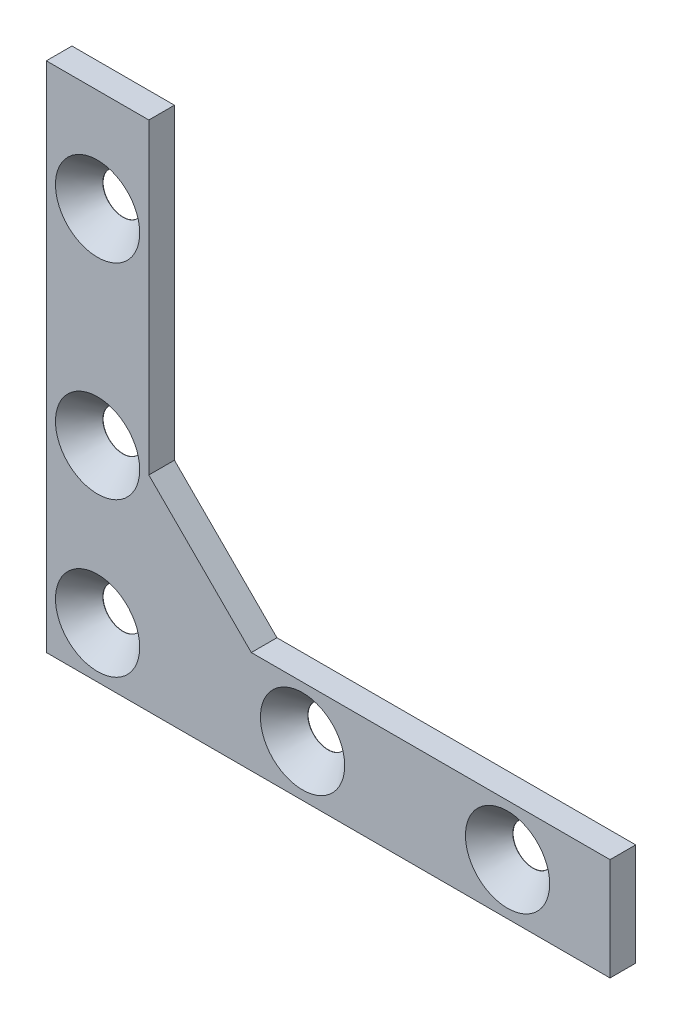
ISO-10303-21;
HEADER;
FILE_DESCRIPTION(('STEP AP214'),'2;1');
FILE_NAME('part.step','',(''),(''),'','','');
FILE_SCHEMA(('AUTOMOTIVE_DESIGN { 1 0 10303 214 1 1 1 1 }'));
ENDSEC;
DATA;
#1=APPLICATION_CONTEXT('core data for automotive mechanical design processes');
#2=APPLICATION_PROTOCOL_DEFINITION('international standard','automotive_design',2000,#1);
#3=PRODUCT_CONTEXT('',#1,'mechanical');
#4=PRODUCT('Part','Part','',(#3));
#5=PRODUCT_RELATED_PRODUCT_CATEGORY('part','',(#4));
#6=PRODUCT_DEFINITION_FORMATION('','',#4);
#7=PRODUCT_DEFINITION_CONTEXT('part definition',#1,'design');
#8=PRODUCT_DEFINITION('design','',#6,#7);
#9=PRODUCT_DEFINITION_SHAPE('','',#8);
#10=(LENGTH_UNIT() NAMED_UNIT(*) SI_UNIT(.MILLI.,.METRE.));
#11=(NAMED_UNIT(*) PLANE_ANGLE_UNIT() SI_UNIT($,.RADIAN.));
#12=(NAMED_UNIT(*) SI_UNIT($,.STERADIAN.) SOLID_ANGLE_UNIT());
#13=UNCERTAINTY_MEASURE_WITH_UNIT(LENGTH_MEASURE(1.E-05),#10,'distance_accuracy_value','');
#14=(GEOMETRIC_REPRESENTATION_CONTEXT(3) GLOBAL_UNCERTAINTY_ASSIGNED_CONTEXT((#13)) GLOBAL_UNIT_ASSIGNED_CONTEXT((#10,
#11,#12)) REPRESENTATION_CONTEXT('',''));
#15=CARTESIAN_POINT('',(0.,0.,0.));
#16=DIRECTION('',(0.,0.,1.));
#17=DIRECTION('',(1.,0.,0.));
#18=AXIS2_PLACEMENT_3D('',#15,#16,#17);
#19=CARTESIAN_POINT('',(-203.603367516007,0.,3.175));
#20=DIRECTION('',(-1.,0.,0.));
#21=DIRECTION('',(0.,0.,1.));
#22=AXIS2_PLACEMENT_3D('',#19,#20,#21);
#23=PLANE('',#22);
#24=DIRECTION('',(0.,1.,0.));
#25=VECTOR('',#24,1.);
#26=CARTESIAN_POINT('',(-203.603367516007,0.,0.));
#27=LINE('',#26,#25);
#28=CARTESIAN_POINT('',(-203.603367516007,0.,0.));
#29=VERTEX_POINT('',#28);
#30=CARTESIAN_POINT('',(-203.603367516007,12.7,0.));
#31=VERTEX_POINT('',#30);
#32=EDGE_CURVE('E142',#29,#31,#27,.T.);
#33=ORIENTED_EDGE('',*,*,#32,.T.);
#34=DIRECTION('',(0.,0.,-1.));
#35=VECTOR('',#34,1.);
#36=CARTESIAN_POINT('',(-203.603367516007,12.7,3.175));
#37=LINE('',#36,#35);
#38=CARTESIAN_POINT('',(-203.603367516007,12.7,3.175));
#39=VERTEX_POINT('',#38);
#40=EDGE_CURVE('E52',#39,#31,#37,.T.);
#41=ORIENTED_EDGE('',*,*,#40,.F.);
#42=DIRECTION('',(0.,1.,0.));
#43=VECTOR('',#42,1.);
#44=CARTESIAN_POINT('',(-203.603367516007,0.,3.175));
#45=LINE('',#44,#43);
#46=CARTESIAN_POINT('',(-203.603367516007,0.,3.175));
#47=VERTEX_POINT('',#46);
#48=EDGE_CURVE('E101',#47,#39,#45,.T.);
#49=ORIENTED_EDGE('',*,*,#48,.F.);
#50=DIRECTION('',(0.,0.,-1.));
#51=VECTOR('',#50,1.);
#52=CARTESIAN_POINT('',(-203.603367516007,0.,3.175));
#53=LINE('',#52,#51);
#54=EDGE_CURVE('E11',#47,#29,#53,.T.);
#55=ORIENTED_EDGE('',*,*,#54,.T.);
#56=EDGE_LOOP('',(#33,#41,#49,#55));
#57=FACE_BOUND('',#56,.T.);
#58=ADVANCED_FACE('F43',(#57),#23,.F.);
#59=CARTESIAN_POINT('',(-203.603367516007,12.7,3.175));
#60=DIRECTION('',(0.,-1.,0.));
#61=DIRECTION('',(1.,0.,0.));
#62=AXIS2_PLACEMENT_3D('',#59,#60,#61);
#63=PLANE('',#62);
#64=DIRECTION('',(-1.,0.,0.));
#65=VECTOR('',#64,1.);
#66=CARTESIAN_POINT('',(-203.603367516007,12.7,0.));
#67=LINE('',#66,#65);
#68=CARTESIAN_POINT('',(-248.053367516007,12.7,0.));
#69=VERTEX_POINT('',#68);
#70=EDGE_CURVE('E145',#31,#69,#67,.T.);
#71=ORIENTED_EDGE('',*,*,#70,.T.);
#72=DIRECTION('',(0.,0.,-1.));
#73=VECTOR('',#72,1.);
#74=CARTESIAN_POINT('',(-248.053367516007,12.7,3.175));
#75=LINE('',#74,#73);
#76=CARTESIAN_POINT('',(-248.053367516007,12.7,3.175));
#77=VERTEX_POINT('',#76);
#78=EDGE_CURVE('E167',#77,#69,#75,.T.);
#79=ORIENTED_EDGE('',*,*,#78,.F.);
#80=DIRECTION('',(-1.,0.,0.));
#81=VECTOR('',#80,1.);
#82=CARTESIAN_POINT('',(-203.603367516007,12.7,3.175));
#83=LINE('',#82,#81);
#84=EDGE_CURVE('E177',#39,#77,#83,.T.);
#85=ORIENTED_EDGE('',*,*,#84,.F.);
#86=ORIENTED_EDGE('',*,*,#40,.T.);
#87=EDGE_LOOP('',(#71,#79,#85,#86));
#88=FACE_BOUND('',#87,.T.);
#89=ADVANCED_FACE('F175',(#88),#63,.F.);
#90=CARTESIAN_POINT('',(-248.053367516007,12.7,3.175));
#91=DIRECTION('',(-0.707106781186547,-0.707106781186548,0.));
#92=DIRECTION('',(0.707106781186548,-0.707106781186547,0.));
#93=AXIS2_PLACEMENT_3D('',#90,#91,#92);
#94=PLANE('',#93);
#95=DIRECTION('',(-0.707106781186548,0.707106781186547,0.));
#96=VECTOR('',#95,1.);
#97=CARTESIAN_POINT('',(-248.053367516007,12.7,0.));
#98=LINE('',#97,#96);
#99=CARTESIAN_POINT('',(-260.753367516007,25.4,0.));
#100=VERTEX_POINT('',#99);
#101=EDGE_CURVE('E149',#69,#100,#98,.T.);
#102=ORIENTED_EDGE('',*,*,#101,.T.);
#103=DIRECTION('',(0.,0.,-1.));
#104=VECTOR('',#103,1.);
#105=CARTESIAN_POINT('',(-260.753367516007,25.4,3.175));
#106=LINE('',#105,#104);
#107=CARTESIAN_POINT('',(-260.753367516007,25.4,3.175));
#108=VERTEX_POINT('',#107);
#109=EDGE_CURVE('E129',#108,#100,#106,.T.);
#110=ORIENTED_EDGE('',*,*,#109,.F.);
#111=DIRECTION('',(-0.707106781186548,0.707106781186547,0.));
#112=VECTOR('',#111,1.);
#113=CARTESIAN_POINT('',(-248.053367516007,12.7,3.175));
#114=LINE('',#113,#112);
#115=EDGE_CURVE('E118',#77,#108,#114,.T.);
#116=ORIENTED_EDGE('',*,*,#115,.F.);
#117=ORIENTED_EDGE('',*,*,#78,.T.);
#118=EDGE_LOOP('',(#102,#110,#116,#117));
#119=FACE_BOUND('',#118,.T.);
#120=ADVANCED_FACE('F184',(#119),#94,.F.);
#121=CARTESIAN_POINT('',(-260.753367516007,25.4,3.175));
#122=DIRECTION('',(-1.,0.,0.));
#123=DIRECTION('',(0.,0.,1.));
#124=AXIS2_PLACEMENT_3D('',#121,#122,#123);
#125=PLANE('',#124);
#126=DIRECTION('',(0.,1.,0.));
#127=VECTOR('',#126,1.);
#128=CARTESIAN_POINT('',(-260.753367516007,25.4,0.));
#129=LINE('',#128,#127);
#130=CARTESIAN_POINT('',(-260.753367516007,63.5,0.));
#131=VERTEX_POINT('',#130);
#132=EDGE_CURVE('E127',#100,#131,#129,.T.);
#133=ORIENTED_EDGE('',*,*,#132,.T.);
#134=DIRECTION('',(0.,0.,-1.));
#135=VECTOR('',#134,1.);
#136=CARTESIAN_POINT('',(-260.753367516007,63.5,3.175));
#137=LINE('',#136,#135);
#138=CARTESIAN_POINT('',(-260.753367516007,63.5,3.175));
#139=VERTEX_POINT('',#138);
#140=EDGE_CURVE('E124',#139,#131,#137,.T.);
#141=ORIENTED_EDGE('',*,*,#140,.F.);
#142=DIRECTION('',(0.,1.,0.));
#143=VECTOR('',#142,1.);
#144=CARTESIAN_POINT('',(-260.753367516007,25.4,3.175));
#145=LINE('',#144,#143);
#146=EDGE_CURVE('E112',#108,#139,#145,.T.);
#147=ORIENTED_EDGE('',*,*,#146,.F.);
#148=ORIENTED_EDGE('',*,*,#109,.T.);
#149=EDGE_LOOP('',(#133,#141,#147,#148));
#150=FACE_BOUND('',#149,.T.);
#151=ADVANCED_FACE('F125',(#150),#125,.F.);
#152=CARTESIAN_POINT('',(-273.453367516007,63.5,3.175));
#153=DIRECTION('',(0.,-1.,0.));
#154=DIRECTION('',(0.,0.,-1.));
#155=AXIS2_PLACEMENT_3D('',#152,#153,#154);
#156=PLANE('',#155);
#157=DIRECTION('',(-1.,0.,0.));
#158=VECTOR('',#157,1.);
#159=CARTESIAN_POINT('',(-273.453367516007,63.5,0.));
#160=LINE('',#159,#158);
#161=CARTESIAN_POINT('',(-273.453367516007,63.5,0.));
#162=VERTEX_POINT('',#161);
#163=EDGE_CURVE('E87',#131,#162,#160,.T.);
#164=ORIENTED_EDGE('',*,*,#163,.T.);
#165=DIRECTION('',(0.,0.,-1.));
#166=VECTOR('',#165,1.);
#167=CARTESIAN_POINT('',(-273.453367516007,63.5,3.175));
#168=LINE('',#167,#166);
#169=CARTESIAN_POINT('',(-273.453367516007,63.5,3.175));
#170=VERTEX_POINT('',#169);
#171=EDGE_CURVE('E130',#170,#162,#168,.T.);
#172=ORIENTED_EDGE('',*,*,#171,.F.);
#173=DIRECTION('',(-1.,0.,0.));
#174=VECTOR('',#173,1.);
#175=CARTESIAN_POINT('',(-273.453367516007,63.5,3.175));
#176=LINE('',#175,#174);
#177=EDGE_CURVE('E116',#139,#170,#176,.T.);
#178=ORIENTED_EDGE('',*,*,#177,.F.);
#179=ORIENTED_EDGE('',*,*,#140,.T.);
#180=EDGE_LOOP('',(#164,#172,#178,#179));
#181=FACE_BOUND('',#180,.T.);
#182=ADVANCED_FACE('F132',(#181),#156,.F.);
#183=CARTESIAN_POINT('',(-273.453367516007,0.,3.175));
#184=DIRECTION('',(1.,0.,0.));
#185=DIRECTION('',(0.,0.,-1.));
#186=AXIS2_PLACEMENT_3D('',#183,#184,#185);
#187=PLANE('',#186);
#188=DIRECTION('',(0.,-1.,0.));
#189=VECTOR('',#188,1.);
#190=CARTESIAN_POINT('',(-273.453367516007,0.,0.));
#191=LINE('',#190,#189);
#192=CARTESIAN_POINT('',(-273.453367516007,0.,0.));
#193=VERTEX_POINT('',#192);
#194=EDGE_CURVE('E94',#162,#193,#191,.T.);
#195=ORIENTED_EDGE('',*,*,#194,.T.);
#196=DIRECTION('',(0.,0.,-1.));
#197=VECTOR('',#196,1.);
#198=CARTESIAN_POINT('',(-273.453367516007,0.,3.175));
#199=LINE('',#198,#197);
#200=CARTESIAN_POINT('',(-273.453367516007,0.,3.175));
#201=VERTEX_POINT('',#200);
#202=EDGE_CURVE('E138',#201,#193,#199,.T.);
#203=ORIENTED_EDGE('',*,*,#202,.F.);
#204=DIRECTION('',(0.,-1.,0.));
#205=VECTOR('',#204,1.);
#206=CARTESIAN_POINT('',(-273.453367516007,0.,3.175));
#207=LINE('',#206,#205);
#208=EDGE_CURVE('E135',#170,#201,#207,.T.);
#209=ORIENTED_EDGE('',*,*,#208,.F.);
#210=ORIENTED_EDGE('',*,*,#171,.T.);
#211=EDGE_LOOP('',(#195,#203,#209,#210));
#212=FACE_BOUND('',#211,.T.);
#213=ADVANCED_FACE('F287',(#212),#187,.F.);
#214=CARTESIAN_POINT('',(-260.753367516007,0.,3.175));
#215=DIRECTION('',(0.,1.,0.));
#216=DIRECTION('',(-1.,0.,0.));
#217=AXIS2_PLACEMENT_3D('',#214,#215,#216);
#218=PLANE('',#217);
#219=DIRECTION('',(1.,0.,0.));
#220=VECTOR('',#219,1.);
#221=CARTESIAN_POINT('',(-260.753367516007,0.,0.));
#222=LINE('',#221,#220);
#223=EDGE_CURVE('E158',#193,#29,#222,.T.);
#224=ORIENTED_EDGE('',*,*,#223,.T.);
#225=ORIENTED_EDGE('',*,*,#54,.F.);
#226=DIRECTION('',(1.,0.,0.));
#227=VECTOR('',#226,1.);
#228=CARTESIAN_POINT('',(-260.753367516007,0.,3.175));
#229=LINE('',#228,#227);
#230=EDGE_CURVE('E60',#201,#47,#229,.T.);
#231=ORIENTED_EDGE('',*,*,#230,.F.);
#232=ORIENTED_EDGE('',*,*,#202,.T.);
#233=EDGE_LOOP('',(#224,#225,#231,#232));
#234=FACE_BOUND('',#233,.T.);
#235=ADVANCED_FACE('F257',(#234),#218,.F.);
#236=CARTESIAN_POINT('',(0.,0.,3.175));
#237=DIRECTION('',(0.,0.,1.));
#238=DIRECTION('',(1.,0.,0.));
#239=AXIS2_PLACEMENT_3D('',#236,#237,#238);
#240=PLANE('',#239);
#241=CARTESIAN_POINT('',(-267.103367516007,6.34999999999994,3.175));
#242=DIRECTION('',(0.,0.,1.));
#243=DIRECTION('',(1.,0.,0.));
#244=AXIS2_PLACEMENT_3D('',#241,#242,#243);
#245=CIRCLE('',#244,5.21969999999999);
#246=CARTESIAN_POINT('',(-261.883667516008,6.34999999999994,3.175));
#247=VERTEX_POINT('',#246);
#248=EDGE_CURVE('E248',#247,#247,#245,.T.);
#249=ORIENTED_EDGE('',*,*,#248,.F.);
#250=EDGE_LOOP('',(#249));
#251=FACE_BOUND('',#250,.T.);
#252=CARTESIAN_POINT('',(-267.103367516007,25.3999999999999,3.175));
#253=DIRECTION('',(0.,0.,1.));
#254=DIRECTION('',(1.,0.,0.));
#255=AXIS2_PLACEMENT_3D('',#252,#253,#254);
#256=CIRCLE('',#255,5.21969999999999);
#257=CARTESIAN_POINT('',(-261.883667516008,25.3999999999999,3.175));
#258=VERTEX_POINT('',#257);
#259=EDGE_CURVE('E236',#258,#258,#256,.T.);
#260=ORIENTED_EDGE('',*,*,#259,.F.);
#261=EDGE_LOOP('',(#260));
#262=FACE_BOUND('',#261,.T.);
#263=CARTESIAN_POINT('',(-267.103367516007,50.8,3.175));
#264=DIRECTION('',(0.,0.,1.));
#265=DIRECTION('',(1.,0.,0.));
#266=AXIS2_PLACEMENT_3D('',#263,#264,#265);
#267=CIRCLE('',#266,5.21969999999999);
#268=CARTESIAN_POINT('',(-261.883667516008,50.8,3.175));
#269=VERTEX_POINT('',#268);
#270=EDGE_CURVE('E224',#269,#269,#267,.T.);
#271=ORIENTED_EDGE('',*,*,#270,.F.);
#272=EDGE_LOOP('',(#271));
#273=FACE_BOUND('',#272,.T.);
#274=CARTESIAN_POINT('',(-241.703367516007,6.34999999999994,3.175));
#275=DIRECTION('',(0.,0.,1.));
#276=DIRECTION('',(1.,0.,0.));
#277=AXIS2_PLACEMENT_3D('',#274,#275,#276);
#278=CIRCLE('',#277,5.21969999999999);
#279=CARTESIAN_POINT('',(-236.483667516008,6.34999999999994,3.175));
#280=VERTEX_POINT('',#279);
#281=EDGE_CURVE('E212',#280,#280,#278,.T.);
#282=ORIENTED_EDGE('',*,*,#281,.F.);
#283=EDGE_LOOP('',(#282));
#284=FACE_BOUND('',#283,.T.);
#285=CARTESIAN_POINT('',(-216.303367516007,6.35000000000003,3.175));
#286=DIRECTION('',(0.,0.,1.));
#287=DIRECTION('',(1.,0.,0.));
#288=AXIS2_PLACEMENT_3D('',#285,#286,#287);
#289=CIRCLE('',#288,5.21969999999999);
#290=CARTESIAN_POINT('',(-211.083667516007,6.35000000000003,3.175));
#291=VERTEX_POINT('',#290);
#292=EDGE_CURVE('E200',#291,#291,#289,.T.);
#293=ORIENTED_EDGE('',*,*,#292,.F.);
#294=EDGE_LOOP('',(#293));
#295=FACE_BOUND('',#294,.T.);
#296=ORIENTED_EDGE('',*,*,#230,.T.);
#297=ORIENTED_EDGE('',*,*,#48,.T.);
#298=ORIENTED_EDGE('',*,*,#84,.T.);
#299=ORIENTED_EDGE('',*,*,#115,.T.);
#300=ORIENTED_EDGE('',*,*,#146,.T.);
#301=ORIENTED_EDGE('',*,*,#177,.T.);
#302=ORIENTED_EDGE('',*,*,#208,.T.);
#303=EDGE_LOOP('',(#296,#297,#298,#299,#300,#301,#302));
#304=FACE_BOUND('',#303,.T.);
#305=ADVANCED_FACE('F114',(#251,#262,#273,#284,#295,#304),#240,.T.);
#306=CARTESIAN_POINT('',(0.,0.,0.));
#307=DIRECTION('',(0.,0.,1.));
#308=DIRECTION('',(1.,0.,0.));
#309=AXIS2_PLACEMENT_3D('',#306,#307,#308);
#310=PLANE('',#309);
#311=CARTESIAN_POINT('',(-267.103367516007,6.34999999999994,0.));
#312=DIRECTION('',(0.,0.,1.));
#313=DIRECTION('',(1.,0.,0.));
#314=AXIS2_PLACEMENT_3D('',#311,#312,#313);
#315=CIRCLE('',#314,2.48920000000002);
#316=CARTESIAN_POINT('',(-264.614167516007,6.34999999999994,0.));
#317=VERTEX_POINT('',#316);
#318=EDGE_CURVE('E240',#317,#317,#315,.T.);
#319=ORIENTED_EDGE('',*,*,#318,.T.);
#320=EDGE_LOOP('',(#319));
#321=FACE_BOUND('',#320,.T.);
#322=CARTESIAN_POINT('',(-267.103367516007,25.3999999999999,0.));
#323=DIRECTION('',(0.,0.,1.));
#324=DIRECTION('',(1.,0.,0.));
#325=AXIS2_PLACEMENT_3D('',#322,#323,#324);
#326=CIRCLE('',#325,2.48920000000002);
#327=CARTESIAN_POINT('',(-264.614167516007,25.3999999999999,0.));
#328=VERTEX_POINT('',#327);
#329=EDGE_CURVE('E228',#328,#328,#326,.T.);
#330=ORIENTED_EDGE('',*,*,#329,.T.);
#331=EDGE_LOOP('',(#330));
#332=FACE_BOUND('',#331,.T.);
#333=CARTESIAN_POINT('',(-267.103367516007,50.8,0.));
#334=DIRECTION('',(0.,0.,1.));
#335=DIRECTION('',(1.,0.,0.));
#336=AXIS2_PLACEMENT_3D('',#333,#334,#335);
#337=CIRCLE('',#336,2.48920000000002);
#338=CARTESIAN_POINT('',(-264.614167516007,50.8,0.));
#339=VERTEX_POINT('',#338);
#340=EDGE_CURVE('E216',#339,#339,#337,.T.);
#341=ORIENTED_EDGE('',*,*,#340,.T.);
#342=EDGE_LOOP('',(#341));
#343=FACE_BOUND('',#342,.T.);
#344=CARTESIAN_POINT('',(-241.703367516007,6.34999999999994,0.));
#345=DIRECTION('',(0.,0.,1.));
#346=DIRECTION('',(1.,0.,0.));
#347=AXIS2_PLACEMENT_3D('',#344,#345,#346);
#348=CIRCLE('',#347,2.4892);
#349=CARTESIAN_POINT('',(-239.214167516007,6.34999999999994,0.));
#350=VERTEX_POINT('',#349);
#351=EDGE_CURVE('E204',#350,#350,#348,.T.);
#352=ORIENTED_EDGE('',*,*,#351,.T.);
#353=EDGE_LOOP('',(#352));
#354=FACE_BOUND('',#353,.T.);
#355=CARTESIAN_POINT('',(-216.303367516007,6.35000000000003,0.));
#356=DIRECTION('',(0.,0.,1.));
#357=DIRECTION('',(1.,0.,0.));
#358=AXIS2_PLACEMENT_3D('',#355,#356,#357);
#359=CIRCLE('',#358,2.4892);
#360=CARTESIAN_POINT('',(-213.814167516007,6.35000000000003,0.));
#361=VERTEX_POINT('',#360);
#362=EDGE_CURVE('E146',#361,#361,#359,.T.);
#363=ORIENTED_EDGE('',*,*,#362,.T.);
#364=EDGE_LOOP('',(#363));
#365=FACE_BOUND('',#364,.T.);
#366=ORIENTED_EDGE('',*,*,#32,.F.);
#367=ORIENTED_EDGE('',*,*,#223,.F.);
#368=ORIENTED_EDGE('',*,*,#194,.F.);
#369=ORIENTED_EDGE('',*,*,#163,.F.);
#370=ORIENTED_EDGE('',*,*,#132,.F.);
#371=ORIENTED_EDGE('',*,*,#101,.F.);
#372=ORIENTED_EDGE('',*,*,#70,.F.);
#373=EDGE_LOOP('',(#366,#367,#368,#369,#370,#371,#372));
#374=FACE_BOUND('',#373,.T.);
#375=ADVANCED_FACE('F181',(#321,#332,#343,#354,#365,#374),#310,.F.);
#376=CARTESIAN_POINT('',(-216.303367516007,6.35000000000003,3.175));
#377=DIRECTION('',(0.,0.,1.));
#378=DIRECTION('',(1.,0.,0.));
#379=AXIS2_PLACEMENT_3D('',#376,#377,#378);
#380=CYLINDRICAL_SURFACE('',#379,2.4892);
#381=ORIENTED_EDGE('',*,*,#362,.F.);
#382=EDGE_LOOP('',(#381));
#383=FACE_BOUND('',#382,.T.);
#384=CARTESIAN_POINT('',(-216.303367516007,6.35000000000003,0.0339190640830126));
#385=DIRECTION('',(0.,0.,1.));
#386=DIRECTION('',(1.,0.,0.));
#387=AXIS2_PLACEMENT_3D('',#384,#385,#386);
#388=CIRCLE('',#387,2.4892);
#389=CARTESIAN_POINT('',(-213.814167516007,6.35000000000003,0.0339190640830126));
#390=VERTEX_POINT('',#389);
#391=EDGE_CURVE('E196',#390,#390,#388,.T.);
#392=ORIENTED_EDGE('',*,*,#391,.T.);
#393=EDGE_LOOP('',(#392));
#394=FACE_BOUND('',#393,.T.);
#395=ADVANCED_FACE('F270',(#383,#394),#380,.F.);
#396=CARTESIAN_POINT('',(-216.303367516007,6.35000000000003,3.175));
#397=DIRECTION('',(0.,0.,1.));
#398=DIRECTION('',(1.,0.,0.));
#399=AXIS2_PLACEMENT_3D('',#396,#397,#398);
#400=CONICAL_SURFACE('',#399,5.21969999999999,0.715584993317671);
#401=ORIENTED_EDGE('',*,*,#391,.F.);
#402=EDGE_LOOP('',(#401));
#403=FACE_BOUND('',#402,.T.);
#404=ORIENTED_EDGE('',*,*,#292,.T.);
#405=EDGE_LOOP('',(#404));
#406=FACE_BOUND('',#405,.T.);
#407=ADVANCED_FACE('F267',(#403,#406),#400,.F.);
#408=CARTESIAN_POINT('',(-241.703367516007,6.34999999999994,3.175));
#409=DIRECTION('',(0.,0.,1.));
#410=DIRECTION('',(1.,0.,0.));
#411=AXIS2_PLACEMENT_3D('',#408,#409,#410);
#412=CYLINDRICAL_SURFACE('',#411,2.4892);
#413=ORIENTED_EDGE('',*,*,#351,.F.);
#414=EDGE_LOOP('',(#413));
#415=FACE_BOUND('',#414,.T.);
#416=CARTESIAN_POINT('',(-241.703367516007,6.34999999999994,0.0339190640830126));
#417=DIRECTION('',(0.,0.,1.));
#418=DIRECTION('',(1.,0.,0.));
#419=AXIS2_PLACEMENT_3D('',#416,#417,#418);
#420=CIRCLE('',#419,2.4892);
#421=CARTESIAN_POINT('',(-239.214167516007,6.34999999999994,0.0339190640830126));
#422=VERTEX_POINT('',#421);
#423=EDGE_CURVE('E208',#422,#422,#420,.T.);
#424=ORIENTED_EDGE('',*,*,#423,.T.);
#425=EDGE_LOOP('',(#424));
#426=FACE_BOUND('',#425,.T.);
#427=ADVANCED_FACE('F269',(#415,#426),#412,.F.);
#428=CARTESIAN_POINT('',(-241.703367516007,6.34999999999994,3.175));
#429=DIRECTION('',(0.,0.,1.));
#430=DIRECTION('',(1.,0.,0.));
#431=AXIS2_PLACEMENT_3D('',#428,#429,#430);
#432=CONICAL_SURFACE('',#431,5.21969999999999,0.715584993317671);
#433=ORIENTED_EDGE('',*,*,#423,.F.);
#434=EDGE_LOOP('',(#433));
#435=FACE_BOUND('',#434,.T.);
#436=ORIENTED_EDGE('',*,*,#281,.T.);
#437=EDGE_LOOP('',(#436));
#438=FACE_BOUND('',#437,.T.);
#439=ADVANCED_FACE('F277',(#435,#438),#432,.F.);
#440=CARTESIAN_POINT('',(-267.103367516007,50.8,3.175));
#441=DIRECTION('',(0.,0.,1.));
#442=DIRECTION('',(1.,0.,0.));
#443=AXIS2_PLACEMENT_3D('',#440,#441,#442);
#444=CYLINDRICAL_SURFACE('',#443,2.4892);
#445=ORIENTED_EDGE('',*,*,#340,.F.);
#446=EDGE_LOOP('',(#445));
#447=FACE_BOUND('',#446,.T.);
#448=CARTESIAN_POINT('',(-267.103367516007,50.8,0.0339190640830126));
#449=DIRECTION('',(0.,0.,1.));
#450=DIRECTION('',(1.,0.,0.));
#451=AXIS2_PLACEMENT_3D('',#448,#449,#450);
#452=CIRCLE('',#451,2.48919999999997);
#453=CARTESIAN_POINT('',(-264.614167516008,50.8,0.0339190640830126));
#454=VERTEX_POINT('',#453);
#455=EDGE_CURVE('E220',#454,#454,#452,.T.);
#456=ORIENTED_EDGE('',*,*,#455,.T.);
#457=EDGE_LOOP('',(#456));
#458=FACE_BOUND('',#457,.T.);
#459=ADVANCED_FACE('F370',(#447,#458),#444,.F.);
#460=CARTESIAN_POINT('',(-267.103367516007,50.8,3.175));
#461=DIRECTION('',(0.,0.,1.));
#462=DIRECTION('',(1.,0.,0.));
#463=AXIS2_PLACEMENT_3D('',#460,#461,#462);
#464=CONICAL_SURFACE('',#463,5.21969999999999,0.715584993317676);
#465=ORIENTED_EDGE('',*,*,#455,.F.);
#466=EDGE_LOOP('',(#465));
#467=FACE_BOUND('',#466,.T.);
#468=ORIENTED_EDGE('',*,*,#270,.T.);
#469=EDGE_LOOP('',(#468));
#470=FACE_BOUND('',#469,.T.);
#471=ADVANCED_FACE('F381',(#467,#470),#464,.F.);
#472=CARTESIAN_POINT('',(-267.103367516007,25.3999999999999,3.175));
#473=DIRECTION('',(0.,0.,1.));
#474=DIRECTION('',(1.,0.,0.));
#475=AXIS2_PLACEMENT_3D('',#472,#473,#474);
#476=CYLINDRICAL_SURFACE('',#475,2.4892);
#477=ORIENTED_EDGE('',*,*,#329,.F.);
#478=EDGE_LOOP('',(#477));
#479=FACE_BOUND('',#478,.T.);
#480=CARTESIAN_POINT('',(-267.103367516007,25.3999999999999,0.0339190640830126));
#481=DIRECTION('',(0.,0.,1.));
#482=DIRECTION('',(1.,0.,0.));
#483=AXIS2_PLACEMENT_3D('',#480,#481,#482);
#484=CIRCLE('',#483,2.48919999999997);
#485=CARTESIAN_POINT('',(-264.614167516008,25.3999999999999,0.0339190640830126));
#486=VERTEX_POINT('',#485);
#487=EDGE_CURVE('E232',#486,#486,#484,.T.);
#488=ORIENTED_EDGE('',*,*,#487,.T.);
#489=EDGE_LOOP('',(#488));
#490=FACE_BOUND('',#489,.T.);
#491=ADVANCED_FACE('F392',(#479,#490),#476,.F.);
#492=CARTESIAN_POINT('',(-267.103367516007,25.3999999999999,3.175));
#493=DIRECTION('',(0.,0.,1.));
#494=DIRECTION('',(1.,0.,0.));
#495=AXIS2_PLACEMENT_3D('',#492,#493,#494);
#496=CONICAL_SURFACE('',#495,5.21969999999999,0.715584993317676);
#497=ORIENTED_EDGE('',*,*,#487,.F.);
#498=EDGE_LOOP('',(#497));
#499=FACE_BOUND('',#498,.T.);
#500=ORIENTED_EDGE('',*,*,#259,.T.);
#501=EDGE_LOOP('',(#500));
#502=FACE_BOUND('',#501,.T.);
#503=ADVANCED_FACE('F403',(#499,#502),#496,.F.);
#504=CARTESIAN_POINT('',(-267.103367516007,6.34999999999994,3.175));
#505=DIRECTION('',(0.,0.,1.));
#506=DIRECTION('',(1.,0.,0.));
#507=AXIS2_PLACEMENT_3D('',#504,#505,#506);
#508=CYLINDRICAL_SURFACE('',#507,2.4892);
#509=ORIENTED_EDGE('',*,*,#318,.F.);
#510=EDGE_LOOP('',(#509));
#511=FACE_BOUND('',#510,.T.);
#512=CARTESIAN_POINT('',(-267.103367516007,6.34999999999994,0.0339190640830126));
#513=DIRECTION('',(0.,0.,1.));
#514=DIRECTION('',(1.,0.,0.));
#515=AXIS2_PLACEMENT_3D('',#512,#513,#514);
#516=CIRCLE('',#515,2.48919999999997);
#517=CARTESIAN_POINT('',(-264.614167516008,6.34999999999994,0.0339190640830126));
#518=VERTEX_POINT('',#517);
#519=EDGE_CURVE('E244',#518,#518,#516,.T.);
#520=ORIENTED_EDGE('',*,*,#519,.T.);
#521=EDGE_LOOP('',(#520));
#522=FACE_BOUND('',#521,.T.);
#523=ADVANCED_FACE('F414',(#511,#522),#508,.F.);
#524=CARTESIAN_POINT('',(-267.103367516007,6.34999999999994,3.175));
#525=DIRECTION('',(0.,0.,1.));
#526=DIRECTION('',(1.,0.,0.));
#527=AXIS2_PLACEMENT_3D('',#524,#525,#526);
#528=CONICAL_SURFACE('',#527,5.21969999999999,0.715584993317676);
#529=ORIENTED_EDGE('',*,*,#519,.F.);
#530=EDGE_LOOP('',(#529));
#531=FACE_BOUND('',#530,.T.);
#532=ORIENTED_EDGE('',*,*,#248,.T.);
#533=EDGE_LOOP('',(#532));
#534=FACE_BOUND('',#533,.T.);
#535=ADVANCED_FACE('F253',(#531,#534),#528,.F.);
#536=CLOSED_SHELL('',(#58,#89,#120,#151,#182,#213,#235,#305,#375,#395,#407,#427,#439,#459,#471,
#491,#503,#523,#535));
#537=MANIFOLD_SOLID_BREP('B2',#536);
#538=ADVANCED_BREP_SHAPE_REPRESENTATION('',(#18,#537),#14);
#539=SHAPE_DEFINITION_REPRESENTATION(#9,#538);
ENDSEC;
END-ISO-10303-21;
